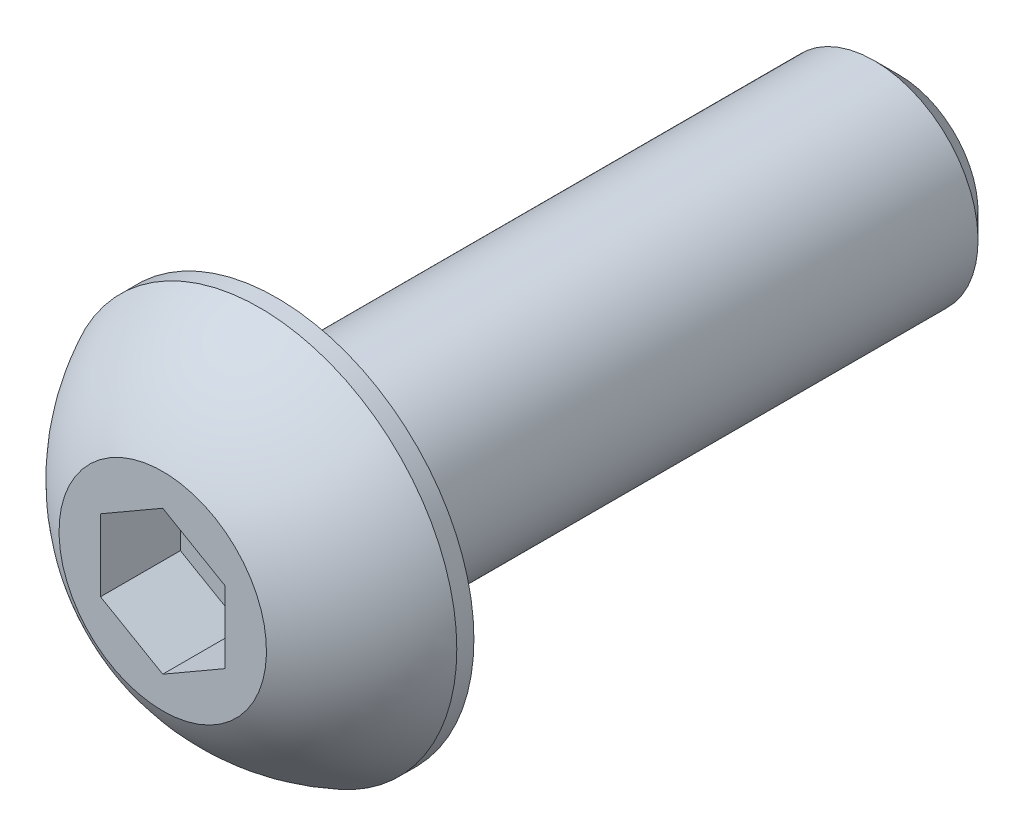
ISO-10303-21;
HEADER;
FILE_DESCRIPTION(('STEP AP214'),'2;1');
FILE_NAME('part.step','',(''),(''),'','','');
FILE_SCHEMA(('AUTOMOTIVE_DESIGN { 1 0 10303 214 1 1 1 1 }'));
ENDSEC;
DATA;
#1=APPLICATION_CONTEXT('core data for automotive mechanical design processes');
#2=APPLICATION_PROTOCOL_DEFINITION('international standard','automotive_design',2000,#1);
#3=PRODUCT_CONTEXT('',#1,'mechanical');
#4=PRODUCT('Part','Part','',(#3));
#5=PRODUCT_RELATED_PRODUCT_CATEGORY('part','',(#4));
#6=PRODUCT_DEFINITION_FORMATION('','',#4);
#7=PRODUCT_DEFINITION_CONTEXT('part definition',#1,'design');
#8=PRODUCT_DEFINITION('design','',#6,#7);
#9=PRODUCT_DEFINITION_SHAPE('','',#8);
#10=(LENGTH_UNIT() NAMED_UNIT(*) SI_UNIT(.MILLI.,.METRE.));
#11=(NAMED_UNIT(*) PLANE_ANGLE_UNIT() SI_UNIT($,.RADIAN.));
#12=(NAMED_UNIT(*) SI_UNIT($,.STERADIAN.) SOLID_ANGLE_UNIT());
#13=UNCERTAINTY_MEASURE_WITH_UNIT(LENGTH_MEASURE(1.E-05),#10,'distance_accuracy_value','');
#14=(GEOMETRIC_REPRESENTATION_CONTEXT(3) GLOBAL_UNCERTAINTY_ASSIGNED_CONTEXT((#13)) GLOBAL_UNIT_ASSIGNED_CONTEXT((#10,
#11,#12)) REPRESENTATION_CONTEXT('',''));
#15=CARTESIAN_POINT('',(0.,0.,0.));
#16=DIRECTION('',(0.,0.,1.));
#17=DIRECTION('',(1.,0.,0.));
#18=AXIS2_PLACEMENT_3D('',#15,#16,#17);
#19=CARTESIAN_POINT('',(0.,-2.5,-17.75));
#20=DIRECTION('',(0.,0.,-1.));
#21=DIRECTION('',(0.,1.,0.));
#22=AXIS2_PLACEMENT_3D('',#19,#20,#21);
#23=PLANE('',#22);
#24=CARTESIAN_POINT('',(0.,0.,-17.75));
#25=DIRECTION('',(0.,0.,-1.));
#26=DIRECTION('',(0.,1.,0.));
#27=AXIS2_PLACEMENT_3D('',#24,#25,#26);
#28=CIRCLE('',#27,1.9);
#29=CARTESIAN_POINT('',(0.,1.9,-17.75));
#30=VERTEX_POINT('',#29);
#31=EDGE_CURVE('E50',#30,#30,#28,.T.);
#32=ORIENTED_EDGE('',*,*,#31,.T.);
#33=EDGE_LOOP('',(#32));
#34=FACE_BOUND('',#33,.T.);
#35=ADVANCED_FACE('F41',(#34),#23,.T.);
#36=CARTESIAN_POINT('',(0.,0.,-17.75));
#37=DIRECTION('',(0.,0.,-1.));
#38=DIRECTION('',(0.,1.,0.));
#39=AXIS2_PLACEMENT_3D('',#36,#37,#38);
#40=CYLINDRICAL_SURFACE('',#39,2.5);
#41=CARTESIAN_POINT('',(0.,0.,-17.15));
#42=DIRECTION('',(0.,0.,-1.));
#43=DIRECTION('',(0.,1.,0.));
#44=AXIS2_PLACEMENT_3D('',#41,#42,#43);
#45=CIRCLE('',#44,2.5);
#46=CARTESIAN_POINT('',(0.,2.5,-17.15));
#47=VERTEX_POINT('',#46);
#48=EDGE_CURVE('E11',#47,#47,#45,.F.);
#49=ORIENTED_EDGE('',*,*,#48,.T.);
#50=EDGE_LOOP('',(#49));
#51=FACE_BOUND('',#50,.T.);
#52=CARTESIAN_POINT('',(0.,0.,-2.75));
#53=DIRECTION('',(0.,0.,1.));
#54=DIRECTION('',(1.,0.,0.));
#55=AXIS2_PLACEMENT_3D('',#52,#53,#54);
#56=CIRCLE('',#55,2.5);
#57=CARTESIAN_POINT('',(2.5,0.,-2.75));
#58=VERTEX_POINT('',#57);
#59=EDGE_CURVE('E177',#58,#58,#56,.F.);
#60=ORIENTED_EDGE('',*,*,#59,.T.);
#61=EDGE_LOOP('',(#60));
#62=FACE_BOUND('',#61,.T.);
#63=ADVANCED_FACE('F187',(#51,#62),#40,.T.);
#64=CARTESIAN_POINT('',(0.,0.,-17.75));
#65=DIRECTION('',(0.,0.,1.));
#66=DIRECTION('',(0.,-1.,0.));
#67=AXIS2_PLACEMENT_3D('',#64,#65,#66);
#68=CONICAL_SURFACE('',#67,1.9,0.785398163397447);
#69=ORIENTED_EDGE('',*,*,#48,.F.);
#70=EDGE_LOOP('',(#69));
#71=FACE_BOUND('',#70,.T.);
#72=ORIENTED_EDGE('',*,*,#31,.F.);
#73=EDGE_LOOP('',(#72));
#74=FACE_BOUND('',#73,.T.);
#75=ADVANCED_FACE('F43',(#71,#74),#68,.T.);
#76=CARTESIAN_POINT('',(0.,0.,-4.65805481283422));
#77=DIRECTION('',(0.,0.,1.));
#78=DIRECTION('',(0.,-1.,0.));
#79=AXIS2_PLACEMENT_3D('',#76,#77,#78);
#80=SPHERICAL_SURFACE('',#79,5.28653711226622);
#81=CARTESIAN_POINT('',(0.,0.,0.));
#82=DIRECTION('',(0.,0.,1.));
#83=DIRECTION('',(1.,0.,0.));
#84=AXIS2_PLACEMENT_3D('',#81,#82,#83);
#85=CIRCLE('',#84,2.5);
#86=CARTESIAN_POINT('',(0.,-2.5,0.));
#87=VERTEX_POINT('',#86);
#88=EDGE_CURVE('E173',#87,#87,#85,.T.);
#89=CARTESIAN_POINT('',(0.,0.,-2.3375));
#90=DIRECTION('',(0.,0.,1.));
#91=DIRECTION('',(1.,0.,0.));
#92=AXIS2_PLACEMENT_3D('',#89,#90,#91);
#93=CIRCLE('',#92,4.75);
#94=CARTESIAN_POINT('',(0.,-4.75,-2.3375));
#95=VERTEX_POINT('',#94);
#96=EDGE_CURVE('E156',#95,#95,#93,.T.);
#97=CARTESIAN_POINT('',(0.,-2.5,0.));
#98=CARTESIAN_POINT('',(0.,-2.53026679982017,-0.0162442824556083));
#99=CARTESIAN_POINT('',(0.,-2.56037522904968,-0.032783641206412));
#100=CARTESIAN_POINT('',(0.,-2.62026400427657,-0.0664460518821861));
#101=CARTESIAN_POINT('',(0.,-2.65004435027396,-0.0835691038071565));
#102=CARTESIAN_POINT('',(0.,-2.70926561698584,-0.118392441415039));
#103=CARTESIAN_POINT('',(0.,-2.73870653770032,-0.136092727097952));
#104=CARTESIAN_POINT('',(0.,-2.79723777417103,-0.172063794044945));
#105=CARTESIAN_POINT('',(0.,-2.82632808992726,-0.190334575309027));
#106=CARTESIAN_POINT('',(0.,-2.8841470610759,-0.227439694392676));
#107=CARTESIAN_POINT('',(0.,-2.91287571646831,-0.246274032212244));
#108=CARTESIAN_POINT('',(0.,-2.96996045130294,-0.284499106978588));
#109=CARTESIAN_POINT('',(0.,-2.99831653074515,-0.303889843925364));
#110=CARTESIAN_POINT('',(0.,-3.05464533901892,-0.343220349244853));
#111=CARTESIAN_POINT('',(0.,-3.08261806785047,-0.363160117617566));
#112=CARTESIAN_POINT('',(0.,-3.13816954607727,-0.403581109164589));
#113=CARTESIAN_POINT('',(0.,-3.16574829547251,-0.4240623323389));
#114=CARTESIAN_POINT('',(0.,-3.22050133565615,-0.465558451209037));
#115=CARTESIAN_POINT('',(0.,-3.24767562644455,-0.486573346904864));
#116=CARTESIAN_POINT('',(0.,-3.30160942393942,-0.529128825735184));
#117=CARTESIAN_POINT('',(0.,-3.32836893064589,-0.550669408869677));
#118=CARTESIAN_POINT('',(0.,-3.38146299210494,-0.594268077753707));
#119=CARTESIAN_POINT('',(0.,-3.40779754685753,-0.616326163503246));
#120=CARTESIAN_POINT('',(0.,-3.46003169800773,-0.66095145615551));
#121=CARTESIAN_POINT('',(0.,-3.48593129440535,-0.683518663058236));
#122=CARTESIAN_POINT('',(0.,-3.53728568771641,-0.729153623103508));
#123=CARTESIAN_POINT('',(0.,-3.56274048462986,-0.752221376246054));
#124=CARTESIAN_POINT('',(0.,-3.61319560685493,-0.798848663663778));
#125=CARTESIAN_POINT('',(0.,-3.63819593216655,-0.822408197938956));
#126=CARTESIAN_POINT('',(0.,-3.68773261175691,-0.870010095651581));
#127=CARTESIAN_POINT('',(0.,-3.71226896603565,-0.894052459089029));
#128=CARTESIAN_POINT('',(0.,-3.76086838042534,-0.942610879694117));
#129=CARTESIAN_POINT('',(0.,-3.78493144053629,-0.967126936861756));
#130=CARTESIAN_POINT('',(0.,-3.83257512329416,-1.01662342950466));
#131=CARTESIAN_POINT('',(0.,-3.85615574594108,-1.04160386497992));
#132=CARTESIAN_POINT('',(0.,-3.90282559378753,-1.0920196223646));
#133=CARTESIAN_POINT('',(0.,-3.92591481898706,-1.11745494427401));
#134=CARTESIAN_POINT('',(0.,-3.97159309867276,-1.1687708098093));
#135=CARTESIAN_POINT('',(0.,-3.99418215315894,-1.19465135343517));
#136=CARTESIAN_POINT('',(0.,-4.03885150820303,-1.24684782851373));
#137=CARTESIAN_POINT('',(0.,-4.06093180876093,-1.27316375996643));
#138=CARTESIAN_POINT('',(0.,-4.10457526604591,-1.32622101137371));
#139=CARTESIAN_POINT('',(0.,-4.12613842277298,-1.3529623313283));
#140=CARTESIAN_POINT('',(0.,-4.16873939899417,-1.40686019877854));
#141=CARTESIAN_POINT('',(0.,-4.1897772184883,-1.4340167462742));
#142=CARTESIAN_POINT('',(0.,-4.23131952645464,-1.488734750071));
#143=CARTESIAN_POINT('',(0.,-4.25182401492686,-1.51629620637214));
#144=CARTESIAN_POINT('',(0.,-4.29229186971308,-1.5718135551894));
#145=CARTESIAN_POINT('',(0.,-4.31225523602708,-1.59976944770551));
#146=CARTESIAN_POINT('',(0.,-4.35163326096594,-1.65606504649041));
#147=CARTESIAN_POINT('',(0.,-4.3710479195908,-1.6844047527592));
#148=CARTESIAN_POINT('',(0.,-4.40932115213664,-1.74145721073709));
#149=CARTESIAN_POINT('',(0.,-4.42817972605762,-1.77016996244618));
#150=CARTESIAN_POINT('',(0.,-4.46533362339398,-1.82795760128831));
#151=CARTESIAN_POINT('',(0.,-4.48362894680934,-1.85703248842136));
#152=CARTESIAN_POINT('',(0.,-4.51964939166499,-1.91553335033324));
#153=CARTESIAN_POINT('',(0.,-4.53737451310527,-1.94495932511208));
#154=CARTESIAN_POINT('',(0.,-4.57224781803529,-2.00415118173237));
#155=CARTESIAN_POINT('',(0.,-4.58939600152503,-2.03391706357382));
#156=CARTESIAN_POINT('',(0.,-4.62310891815402,-2.09377742234707));
#157=CARTESIAN_POINT('',(0.,-4.63967365129327,-2.12387189927887));
#158=CARTESIAN_POINT('',(0.,-4.67221336026297,-2.18437801974018));
#159=CARTESIAN_POINT('',(0.,-4.68818833609342,-2.21478966326969));
#160=CARTESIAN_POINT('',(0.,-4.71954250823692,-2.27591853680649));
#161=CARTESIAN_POINT('',(0.,-4.73492170454996,-2.30663576681378));
#162=CARTESIAN_POINT('',(0.,-4.75,-2.3375));
#163=B_SPLINE_CURVE_WITH_KNOTS('',3,(#97,#98,#99,#100,#101,#102,#103,#104,#105,#106,#107,#108,
#109,#110,#111,#112,#113,#114,#115,#116,#117,#118,#119,#120,#121,#122,#123,#124,#125,#126,#127,
#128,#129,#130,#131,#132,#133,#134,#135,#136,#137,#138,#139,#140,#141,#142,#143,#144,#145,#146,
#147,#148,#149,#150,#151,#152,#153,#154,#155,#156,#157,#158,#159,#160,#161,#162),.UNSPECIFIED.,
.F.,.F.,(4,2,2,2,2,2,2,2,2,2,2,2,2,2,2,2,2,2,2,2,2,2,2,2,2,2,2,2,2,2,2,2,4),(0.,
0.10304982363783,0.206099647275662,0.309149470913491,0.412199294551322,0.515249118189152,
0.618298941826982,0.721348765464813,0.824398589102643,0.927448412740473,1.0304982363783,
1.13354806001613,1.23659788365396,1.33964770729179,1.44269753092962,1.54574735456746,
1.64879717820529,1.75184700184312,1.85489682548095,1.95794664911878,2.06099647275661,
2.16404629639444,2.26709612003227,2.3701459436701,2.47319576730793,2.57624559094576,
2.67929541458359,2.78234523822142,2.88539506185925,2.98844488549708,3.09149470913491,
3.19454453277274,3.29759435641057),.UNSPECIFIED.);
#164=EDGE_CURVE('BSEAM186',#87,#95,#163,.T.);
#165=ORIENTED_EDGE('',*,*,#88,.F.);
#166=ORIENTED_EDGE('',*,*,#96,.T.);
#167=ORIENTED_EDGE('',*,*,#164,.T.);
#168=ORIENTED_EDGE('',*,*,#164,.F.);
#169=EDGE_LOOP('',(#165,#167,#166,#168));
#170=FACE_BOUND('',#169,.T.);
#171=ADVANCED_FACE('F186',(#170),#80,.T.);
#172=CARTESIAN_POINT('',(0.,-2.5,0.));
#173=DIRECTION('',(0.,0.,-1.));
#174=DIRECTION('',(-1.,0.,0.));
#175=AXIS2_PLACEMENT_3D('',#172,#173,#174);
#176=PLANE('',#175);
#177=DIRECTION('',(0.,1.,0.));
#178=VECTOR('',#177,1.);
#179=CARTESIAN_POINT('',(1.5,-0.866025403784438,0.));
#180=LINE('',#179,#178);
#181=CARTESIAN_POINT('',(1.5,-0.866025403784439,0.));
#182=VERTEX_POINT('',#181);
#183=CARTESIAN_POINT('',(1.5,0.866025403784439,0.));
#184=VERTEX_POINT('',#183);
#185=EDGE_CURVE('E137',#182,#184,#180,.T.);
#186=ORIENTED_EDGE('',*,*,#185,.F.);
#187=DIRECTION('',(0.866025403784438,0.5,0.));
#188=VECTOR('',#187,1.);
#189=CARTESIAN_POINT('',(0.,-1.73205080756888,0.));
#190=LINE('',#189,#188);
#191=CARTESIAN_POINT('',(0.,-1.73205080756888,0.));
#192=VERTEX_POINT('',#191);
#193=EDGE_CURVE('E57',#192,#182,#190,.T.);
#194=ORIENTED_EDGE('',*,*,#193,.F.);
#195=DIRECTION('',(0.866025403784439,-0.5,0.));
#196=VECTOR('',#195,1.);
#197=CARTESIAN_POINT('',(-1.5,-0.866025403784439,0.));
#198=LINE('',#197,#196);
#199=CARTESIAN_POINT('',(-1.5,-0.866025403784439,0.));
#200=VERTEX_POINT('',#199);
#201=EDGE_CURVE('E150',#200,#192,#198,.T.);
#202=ORIENTED_EDGE('',*,*,#201,.F.);
#203=DIRECTION('',(0.,-1.,0.));
#204=VECTOR('',#203,1.);
#205=CARTESIAN_POINT('',(-1.5,0.866025403784438,0.));
#206=LINE('',#205,#204);
#207=CARTESIAN_POINT('',(-1.5,0.866025403784438,0.));
#208=VERTEX_POINT('',#207);
#209=EDGE_CURVE('E147',#208,#200,#206,.T.);
#210=ORIENTED_EDGE('',*,*,#209,.F.);
#211=DIRECTION('',(-0.866025403784438,-0.5,0.));
#212=VECTOR('',#211,1.);
#213=CARTESIAN_POINT('',(0.,1.73205080756888,0.));
#214=LINE('',#213,#212);
#215=CARTESIAN_POINT('',(0.,1.73205080756888,0.));
#216=VERTEX_POINT('',#215);
#217=EDGE_CURVE('E105',#216,#208,#214,.T.);
#218=ORIENTED_EDGE('',*,*,#217,.F.);
#219=DIRECTION('',(-0.866025403784439,0.5,0.));
#220=VECTOR('',#219,1.);
#221=CARTESIAN_POINT('',(1.5,0.866025403784439,0.));
#222=LINE('',#221,#220);
#223=EDGE_CURVE('E141',#184,#216,#222,.T.);
#224=ORIENTED_EDGE('',*,*,#223,.F.);
#225=EDGE_LOOP('',(#186,#194,#202,#210,#218,#224));
#226=FACE_BOUND('',#225,.T.);
#227=ORIENTED_EDGE('',*,*,#88,.T.);
#228=EDGE_LOOP('',(#227));
#229=FACE_BOUND('',#228,.T.);
#230=ADVANCED_FACE('F193',(#226,#229),#176,.F.);
#231=CARTESIAN_POINT('',(0.,-4.75,-2.75));
#232=DIRECTION('',(0.,0.,1.));
#233=DIRECTION('',(1.,0.,0.));
#234=AXIS2_PLACEMENT_3D('',#231,#232,#233);
#235=PLANE('',#234);
#236=ORIENTED_EDGE('',*,*,#59,.F.);
#237=EDGE_LOOP('',(#236));
#238=FACE_BOUND('',#237,.T.);
#239=CARTESIAN_POINT('',(0.,0.,-2.75));
#240=DIRECTION('',(0.,0.,1.));
#241=DIRECTION('',(1.,0.,0.));
#242=AXIS2_PLACEMENT_3D('',#239,#240,#241);
#243=CIRCLE('',#242,4.75);
#244=CARTESIAN_POINT('',(4.75,0.,-2.75));
#245=VERTEX_POINT('',#244);
#246=EDGE_CURVE('E169',#245,#245,#243,.T.);
#247=ORIENTED_EDGE('',*,*,#246,.F.);
#248=EDGE_LOOP('',(#247));
#249=FACE_BOUND('',#248,.T.);
#250=ADVANCED_FACE('F205',(#238,#249),#235,.F.);
#251=CARTESIAN_POINT('',(0.,0.,0.));
#252=DIRECTION('',(0.,0.,1.));
#253=DIRECTION('',(1.,0.,0.));
#254=AXIS2_PLACEMENT_3D('',#251,#252,#253);
#255=CYLINDRICAL_SURFACE('',#254,4.75);
#256=ORIENTED_EDGE('',*,*,#96,.F.);
#257=EDGE_LOOP('',(#256));
#258=FACE_BOUND('',#257,.T.);
#259=ORIENTED_EDGE('',*,*,#246,.T.);
#260=EDGE_LOOP('',(#259));
#261=FACE_BOUND('',#260,.T.);
#262=ADVANCED_FACE('F209',(#258,#261),#255,.T.);
#263=CARTESIAN_POINT('',(0.,-1.73205080756888,-1.925));
#264=DIRECTION('',(0.5,-0.866025403784438,0.));
#265=DIRECTION('',(0.866025403784438,0.5,0.));
#266=AXIS2_PLACEMENT_3D('',#263,#264,#265);
#267=PLANE('',#266);
#268=ORIENTED_EDGE('',*,*,#193,.T.);
#269=DIRECTION('',(0.,0.,1.));
#270=VECTOR('',#269,1.);
#271=CARTESIAN_POINT('',(1.5,-0.866025403784438,-1.925));
#272=LINE('',#271,#270);
#273=CARTESIAN_POINT('',(1.5,-0.866025403784438,-1.925));
#274=VERTEX_POINT('',#273);
#275=EDGE_CURVE('E87',#274,#182,#272,.T.);
#276=ORIENTED_EDGE('',*,*,#275,.F.);
#277=DIRECTION('',(0.866025403784438,0.5,0.));
#278=VECTOR('',#277,1.);
#279=CARTESIAN_POINT('',(0.,-1.73205080756888,-1.925));
#280=LINE('',#279,#278);
#281=CARTESIAN_POINT('',(0.,-1.73205080756888,-1.925));
#282=VERTEX_POINT('',#281);
#283=EDGE_CURVE('E153',#282,#274,#280,.T.);
#284=ORIENTED_EDGE('',*,*,#283,.F.);
#285=DIRECTION('',(0.,0.,1.));
#286=VECTOR('',#285,1.);
#287=CARTESIAN_POINT('',(0.,-1.73205080756888,-1.925));
#288=LINE('',#287,#286);
#289=EDGE_CURVE('E65',#282,#192,#288,.T.);
#290=ORIENTED_EDGE('',*,*,#289,.T.);
#291=EDGE_LOOP('',(#268,#276,#284,#290));
#292=FACE_BOUND('',#291,.T.);
#293=ADVANCED_FACE('F213',(#292),#267,.F.);
#294=CARTESIAN_POINT('',(-1.5,-0.866025403784439,-1.925));
#295=DIRECTION('',(-0.5,-0.866025403784439,0.));
#296=DIRECTION('',(0.866025403784439,-0.5,0.));
#297=AXIS2_PLACEMENT_3D('',#294,#295,#296);
#298=PLANE('',#297);
#299=ORIENTED_EDGE('',*,*,#201,.T.);
#300=ORIENTED_EDGE('',*,*,#289,.F.);
#301=DIRECTION('',(0.866025403784439,-0.5,0.));
#302=VECTOR('',#301,1.);
#303=CARTESIAN_POINT('',(-1.5,-0.866025403784439,-1.925));
#304=LINE('',#303,#302);
#305=CARTESIAN_POINT('',(-1.5,-0.866025403784439,-1.925));
#306=VERTEX_POINT('',#305);
#307=EDGE_CURVE('E119',#306,#282,#304,.T.);
#308=ORIENTED_EDGE('',*,*,#307,.F.);
#309=DIRECTION('',(0.,0.,1.));
#310=VECTOR('',#309,1.);
#311=CARTESIAN_POINT('',(-1.5,-0.866025403784439,-1.925));
#312=LINE('',#311,#310);
#313=EDGE_CURVE('E110',#306,#200,#312,.T.);
#314=ORIENTED_EDGE('',*,*,#313,.T.);
#315=EDGE_LOOP('',(#299,#300,#308,#314));
#316=FACE_BOUND('',#315,.T.);
#317=ADVANCED_FACE('F217',(#316),#298,.F.);
#318=CARTESIAN_POINT('',(-1.5,0.866025403784438,-1.925));
#319=DIRECTION('',(-1.,0.,0.));
#320=DIRECTION('',(0.,0.,1.));
#321=AXIS2_PLACEMENT_3D('',#318,#319,#320);
#322=PLANE('',#321);
#323=ORIENTED_EDGE('',*,*,#209,.T.);
#324=ORIENTED_EDGE('',*,*,#313,.F.);
#325=DIRECTION('',(0.,-1.,0.));
#326=VECTOR('',#325,1.);
#327=CARTESIAN_POINT('',(-1.5,0.866025403784438,-1.925));
#328=LINE('',#327,#326);
#329=CARTESIAN_POINT('',(-1.5,0.866025403784438,-1.925));
#330=VERTEX_POINT('',#329);
#331=EDGE_CURVE('E114',#330,#306,#328,.T.);
#332=ORIENTED_EDGE('',*,*,#331,.F.);
#333=DIRECTION('',(0.,0.,1.));
#334=VECTOR('',#333,1.);
#335=CARTESIAN_POINT('',(-1.5,0.866025403784438,-1.925));
#336=LINE('',#335,#334);
#337=EDGE_CURVE('E98',#330,#208,#336,.T.);
#338=ORIENTED_EDGE('',*,*,#337,.T.);
#339=EDGE_LOOP('',(#323,#324,#332,#338));
#340=FACE_BOUND('',#339,.T.);
#341=ADVANCED_FACE('F115',(#340),#322,.F.);
#342=CARTESIAN_POINT('',(0.,1.73205080756888,-1.925));
#343=DIRECTION('',(-0.5,0.866025403784438,0.));
#344=DIRECTION('',(-0.866025403784438,-0.5,0.));
#345=AXIS2_PLACEMENT_3D('',#342,#343,#344);
#346=PLANE('',#345);
#347=ORIENTED_EDGE('',*,*,#217,.T.);
#348=ORIENTED_EDGE('',*,*,#337,.F.);
#349=DIRECTION('',(-0.866025403784438,-0.5,0.));
#350=VECTOR('',#349,1.);
#351=CARTESIAN_POINT('',(0.,1.73205080756888,-1.925));
#352=LINE('',#351,#350);
#353=CARTESIAN_POINT('',(0.,1.73205080756888,-1.925));
#354=VERTEX_POINT('',#353);
#355=EDGE_CURVE('E102',#354,#330,#352,.T.);
#356=ORIENTED_EDGE('',*,*,#355,.F.);
#357=DIRECTION('',(0.,0.,1.));
#358=VECTOR('',#357,1.);
#359=CARTESIAN_POINT('',(0.,1.73205080756888,-1.925));
#360=LINE('',#359,#358);
#361=EDGE_CURVE('E111',#354,#216,#360,.T.);
#362=ORIENTED_EDGE('',*,*,#361,.T.);
#363=EDGE_LOOP('',(#347,#348,#356,#362));
#364=FACE_BOUND('',#363,.T.);
#365=ADVANCED_FACE('F100',(#364),#346,.F.);
#366=CARTESIAN_POINT('',(1.5,0.866025403784439,-1.925));
#367=DIRECTION('',(0.5,0.866025403784439,0.));
#368=DIRECTION('',(-0.866025403784439,0.5,0.));
#369=AXIS2_PLACEMENT_3D('',#366,#367,#368);
#370=PLANE('',#369);
#371=ORIENTED_EDGE('',*,*,#223,.T.);
#372=ORIENTED_EDGE('',*,*,#361,.F.);
#373=DIRECTION('',(-0.866025403784439,0.5,0.));
#374=VECTOR('',#373,1.);
#375=CARTESIAN_POINT('',(1.5,0.866025403784439,-1.925));
#376=LINE('',#375,#374);
#377=CARTESIAN_POINT('',(1.5,0.866025403784439,-1.925));
#378=VERTEX_POINT('',#377);
#379=EDGE_CURVE('E125',#378,#354,#376,.T.);
#380=ORIENTED_EDGE('',*,*,#379,.F.);
#381=DIRECTION('',(0.,0.,1.));
#382=VECTOR('',#381,1.);
#383=CARTESIAN_POINT('',(1.5,0.866025403784439,-1.925));
#384=LINE('',#383,#382);
#385=EDGE_CURVE('E161',#378,#184,#384,.T.);
#386=ORIENTED_EDGE('',*,*,#385,.T.);
#387=EDGE_LOOP('',(#371,#372,#380,#386));
#388=FACE_BOUND('',#387,.T.);
#389=ADVANCED_FACE('F221',(#388),#370,.F.);
#390=CARTESIAN_POINT('',(1.5,-0.866025403784438,-1.925));
#391=DIRECTION('',(1.,0.,0.));
#392=DIRECTION('',(0.,0.,-1.));
#393=AXIS2_PLACEMENT_3D('',#390,#391,#392);
#394=PLANE('',#393);
#395=ORIENTED_EDGE('',*,*,#185,.T.);
#396=ORIENTED_EDGE('',*,*,#385,.F.);
#397=DIRECTION('',(0.,1.,0.));
#398=VECTOR('',#397,1.);
#399=CARTESIAN_POINT('',(1.5,-0.866025403784438,-1.925));
#400=LINE('',#399,#398);
#401=EDGE_CURVE('E129',#274,#378,#400,.T.);
#402=ORIENTED_EDGE('',*,*,#401,.F.);
#403=ORIENTED_EDGE('',*,*,#275,.T.);
#404=EDGE_LOOP('',(#395,#396,#402,#403));
#405=FACE_BOUND('',#404,.T.);
#406=ADVANCED_FACE('F218',(#405),#394,.F.);
#407=CARTESIAN_POINT('',(1.5,-0.866025403784438,-1.925));
#408=DIRECTION('',(0.,0.,1.));
#409=DIRECTION('',(1.,0.,0.));
#410=AXIS2_PLACEMENT_3D('',#407,#408,#409);
#411=PLANE('',#410);
#412=ORIENTED_EDGE('',*,*,#283,.T.);
#413=ORIENTED_EDGE('',*,*,#401,.T.);
#414=ORIENTED_EDGE('',*,*,#379,.T.);
#415=ORIENTED_EDGE('',*,*,#355,.T.);
#416=ORIENTED_EDGE('',*,*,#331,.T.);
#417=ORIENTED_EDGE('',*,*,#307,.T.);
#418=EDGE_LOOP('',(#412,#413,#414,#415,#416,#417));
#419=FACE_BOUND('',#418,.T.);
#420=ADVANCED_FACE('F122',(#419),#411,.T.);
#421=CLOSED_SHELL('',(#35,#63,#75,#171,#230,#250,#262,#293,#317,#341,#365,#389,#406,#420));
#422=MANIFOLD_SOLID_BREP('B2',#421);
#423=ADVANCED_BREP_SHAPE_REPRESENTATION('',(#18,#422),#14);
#424=SHAPE_DEFINITION_REPRESENTATION(#9,#423);
ENDSEC;
END-ISO-10303-21;
